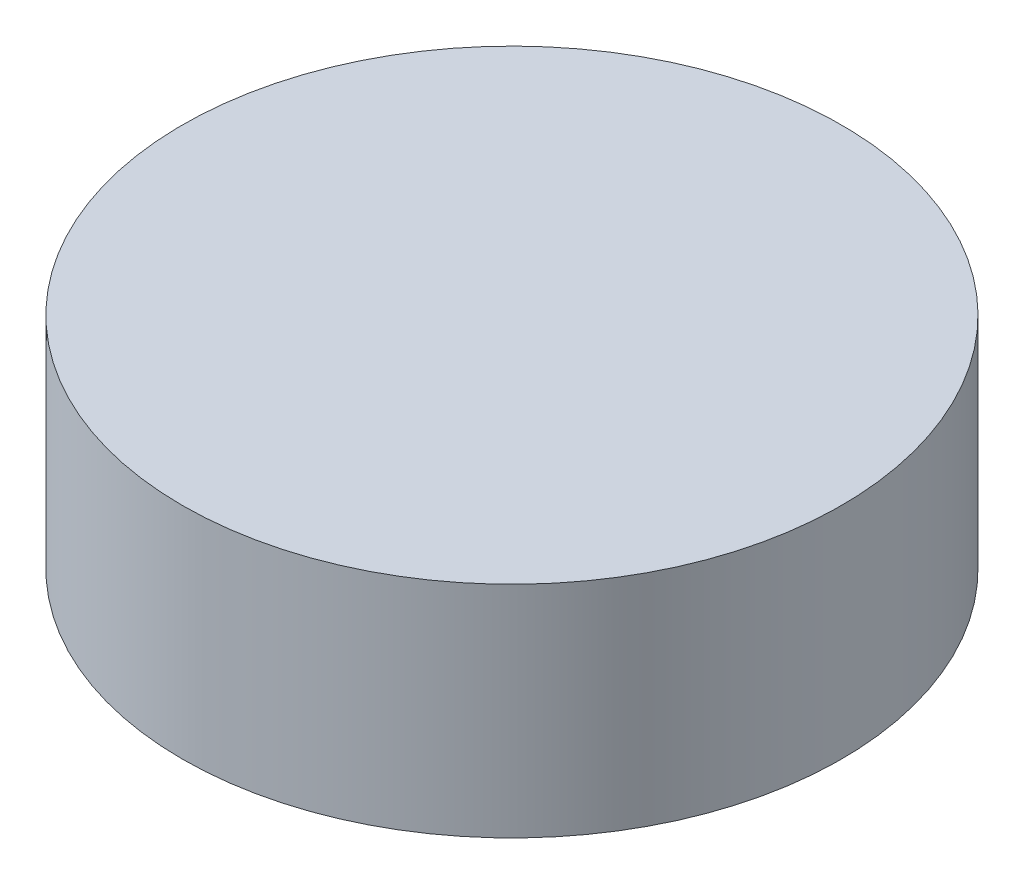
ISO-10303-21;
HEADER;
FILE_DESCRIPTION(('STEP AP214'),'2;1');
FILE_NAME('part.step','',(''),(''),'','','');
FILE_SCHEMA(('AUTOMOTIVE_DESIGN { 1 0 10303 214 1 1 1 1 }'));
ENDSEC;
DATA;
#1=APPLICATION_CONTEXT('core data for automotive mechanical design processes');
#2=APPLICATION_PROTOCOL_DEFINITION('international standard','automotive_design',2000,#1);
#3=PRODUCT_CONTEXT('',#1,'mechanical');
#4=PRODUCT('Part','Part','',(#3));
#5=PRODUCT_RELATED_PRODUCT_CATEGORY('part','',(#4));
#6=PRODUCT_DEFINITION_FORMATION('','',#4);
#7=PRODUCT_DEFINITION_CONTEXT('part definition',#1,'design');
#8=PRODUCT_DEFINITION('design','',#6,#7);
#9=PRODUCT_DEFINITION_SHAPE('','',#8);
#10=(LENGTH_UNIT() NAMED_UNIT(*) SI_UNIT(.MILLI.,.METRE.));
#11=(NAMED_UNIT(*) PLANE_ANGLE_UNIT() SI_UNIT($,.RADIAN.));
#12=(NAMED_UNIT(*) SI_UNIT($,.STERADIAN.) SOLID_ANGLE_UNIT());
#13=UNCERTAINTY_MEASURE_WITH_UNIT(LENGTH_MEASURE(1.E-05),#10,'distance_accuracy_value','');
#14=(GEOMETRIC_REPRESENTATION_CONTEXT(3) GLOBAL_UNCERTAINTY_ASSIGNED_CONTEXT((#13)) GLOBAL_UNIT_ASSIGNED_CONTEXT((#10,
#11,#12)) REPRESENTATION_CONTEXT('',''));
#15=CARTESIAN_POINT('',(0.,0.,0.));
#16=DIRECTION('',(0.,0.,1.));
#17=DIRECTION('',(1.,0.,0.));
#18=AXIS2_PLACEMENT_3D('',#15,#16,#17);
#19=CARTESIAN_POINT('',(0.,100.,0.));
#20=DIRECTION('',(0.,-1.,0.));
#21=DIRECTION('',(0.,0.,-1.));
#22=AXIS2_PLACEMENT_3D('',#19,#20,#21);
#23=CYLINDRICAL_SURFACE('',#22,150.);
#24=CARTESIAN_POINT('',(0.,100.,0.));
#25=DIRECTION('',(0.,1.,0.));
#26=DIRECTION('',(0.,0.,1.));
#27=AXIS2_PLACEMENT_3D('',#24,#25,#26);
#28=CIRCLE('',#27,150.);
#29=CARTESIAN_POINT('',(0.,100.,150.));
#30=VERTEX_POINT('',#29);
#31=EDGE_CURVE('E10',#30,#30,#28,.T.);
#32=ORIENTED_EDGE('',*,*,#31,.F.);
#33=EDGE_LOOP('',(#32));
#34=FACE_BOUND('',#33,.T.);
#35=CARTESIAN_POINT('',(0.,0.,0.));
#36=DIRECTION('',(0.,1.,0.));
#37=DIRECTION('',(0.,0.,1.));
#38=AXIS2_PLACEMENT_3D('',#35,#36,#37);
#39=CIRCLE('',#38,150.);
#40=CARTESIAN_POINT('',(0.,0.,150.));
#41=VERTEX_POINT('',#40);
#42=EDGE_CURVE('E37',#41,#41,#39,.T.);
#43=ORIENTED_EDGE('',*,*,#42,.T.);
#44=EDGE_LOOP('',(#43));
#45=FACE_BOUND('',#44,.T.);
#46=ADVANCED_FACE('F34',(#34,#45),#23,.T.);
#47=CARTESIAN_POINT('',(0.,100.,0.));
#48=DIRECTION('',(0.,1.,0.));
#49=DIRECTION('',(0.,0.,1.));
#50=AXIS2_PLACEMENT_3D('',#47,#48,#49);
#51=PLANE('',#50);
#52=ORIENTED_EDGE('',*,*,#31,.T.);
#53=EDGE_LOOP('',(#52));
#54=FACE_BOUND('',#53,.T.);
#55=ADVANCED_FACE('F49',(#54),#51,.T.);
#56=CARTESIAN_POINT('',(0.,0.,0.));
#57=DIRECTION('',(0.,1.,0.));
#58=DIRECTION('',(0.,0.,1.));
#59=AXIS2_PLACEMENT_3D('',#56,#57,#58);
#60=PLANE('',#59);
#61=ORIENTED_EDGE('',*,*,#42,.F.);
#62=EDGE_LOOP('',(#61));
#63=FACE_BOUND('',#62,.T.);
#64=ADVANCED_FACE('F47',(#63),#60,.F.);
#65=CLOSED_SHELL('',(#46,#55,#64));
#66=MANIFOLD_SOLID_BREP('B2',#65);
#67=ADVANCED_BREP_SHAPE_REPRESENTATION('',(#18,#66),#14);
#68=SHAPE_DEFINITION_REPRESENTATION(#9,#67);
ENDSEC;
END-ISO-10303-21;
